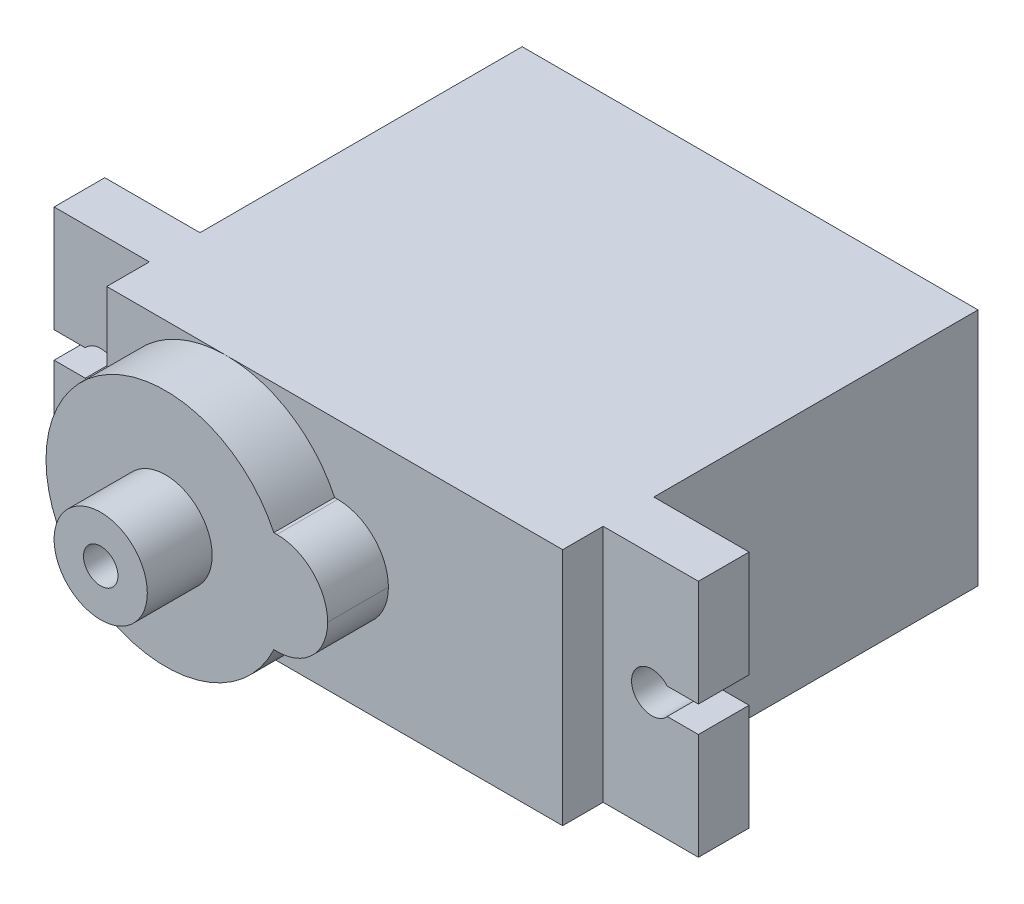
ISO-10303-21;
HEADER;
FILE_DESCRIPTION(('STEP AP214'),'2;1');
FILE_NAME('part.step','',(''),(''),'','','');
FILE_SCHEMA(('AUTOMOTIVE_DESIGN { 1 0 10303 214 1 1 1 1 }'));
ENDSEC;
DATA;
#1=APPLICATION_CONTEXT('core data for automotive mechanical design processes');
#2=APPLICATION_PROTOCOL_DEFINITION('international standard','automotive_design',2000,#1);
#3=PRODUCT_CONTEXT('',#1,'mechanical');
#4=PRODUCT('Part','Part','',(#3));
#5=PRODUCT_RELATED_PRODUCT_CATEGORY('part','',(#4));
#6=PRODUCT_DEFINITION_FORMATION('','',#4);
#7=PRODUCT_DEFINITION_CONTEXT('part definition',#1,'design');
#8=PRODUCT_DEFINITION('design','',#6,#7);
#9=PRODUCT_DEFINITION_SHAPE('','',#8);
#10=(LENGTH_UNIT() NAMED_UNIT(*) SI_UNIT(.MILLI.,.METRE.));
#11=(NAMED_UNIT(*) PLANE_ANGLE_UNIT() SI_UNIT($,.RADIAN.));
#12=(NAMED_UNIT(*) SI_UNIT($,.STERADIAN.) SOLID_ANGLE_UNIT());
#13=UNCERTAINTY_MEASURE_WITH_UNIT(LENGTH_MEASURE(1.E-05),#10,'distance_accuracy_value','');
#14=(GEOMETRIC_REPRESENTATION_CONTEXT(3) GLOBAL_UNCERTAINTY_ASSIGNED_CONTEXT((#13)) GLOBAL_UNIT_ASSIGNED_CONTEXT((#10,
#11,#12)) REPRESENTATION_CONTEXT('',''));
#15=CARTESIAN_POINT('',(0.,0.,0.));
#16=DIRECTION('',(0.,0.,1.));
#17=DIRECTION('',(1.,0.,0.));
#18=AXIS2_PLACEMENT_3D('',#15,#16,#17);
#19=CARTESIAN_POINT('',(19.1009090909091,0.,0.));
#20=DIRECTION('',(-1.,0.,0.));
#21=DIRECTION('',(0.,0.,1.));
#22=AXIS2_PLACEMENT_3D('',#19,#20,#21);
#23=PLANE('',#22);
#24=DIRECTION('',(0.,-1.,0.));
#25=VECTOR('',#24,1.);
#26=CARTESIAN_POINT('',(19.1009090909091,10.3786363636364,18.5));
#27=LINE('',#26,#25);
#28=CARTESIAN_POINT('',(19.1009090909091,10.3786363636364,18.5));
#29=VERTEX_POINT('',#28);
#30=CARTESIAN_POINT('',(19.1009090909091,5.12863636363636,18.5));
#31=VERTEX_POINT('',#30);
#32=EDGE_CURVE('E442',#29,#31,#27,.T.);
#33=ORIENTED_EDGE('',*,*,#32,.T.);
#34=DIRECTION('',(0.,0.,1.));
#35=VECTOR('',#34,1.);
#36=CARTESIAN_POINT('',(19.1009090909091,5.12863636363636,16.));
#37=LINE('',#36,#35);
#38=CARTESIAN_POINT('',(19.1009090909091,5.12863636363636,16.));
#39=VERTEX_POINT('',#38);
#40=EDGE_CURVE('E277',#39,#31,#37,.T.);
#41=ORIENTED_EDGE('',*,*,#40,.F.);
#42=DIRECTION('',(0.,-1.,0.));
#43=VECTOR('',#42,1.);
#44=CARTESIAN_POINT('',(19.1009090909091,10.3786363636364,16.));
#45=LINE('',#44,#43);
#46=CARTESIAN_POINT('',(19.1009090909091,10.3786363636364,16.));
#47=VERTEX_POINT('',#46);
#48=EDGE_CURVE('E434',#47,#39,#45,.T.);
#49=ORIENTED_EDGE('',*,*,#48,.F.);
#50=DIRECTION('',(0.,0.,-1.));
#51=VECTOR('',#50,1.);
#52=CARTESIAN_POINT('',(19.1009090909091,10.3786363636364,18.5));
#53=LINE('',#52,#51);
#54=EDGE_CURVE('E428',#29,#47,#53,.T.);
#55=ORIENTED_EDGE('',*,*,#54,.F.);
#56=EDGE_LOOP('',(#33,#41,#49,#55));
#57=FACE_BOUND('',#56,.T.);
#58=ADVANCED_FACE('F63',(#57),#23,.F.);
#59=CARTESIAN_POINT('',(-12.7990909090909,0.,0.));
#60=DIRECTION('',(-1.,0.,0.));
#61=DIRECTION('',(0.,0.,1.));
#62=AXIS2_PLACEMENT_3D('',#59,#60,#61);
#63=PLANE('',#62);
#64=DIRECTION('',(0.,0.,1.));
#65=VECTOR('',#64,1.);
#66=CARTESIAN_POINT('',(-12.7990909090909,3.82863636363636,0.));
#67=LINE('',#66,#65);
#68=CARTESIAN_POINT('',(-12.7990909090909,3.82863636363636,15.9));
#69=VERTEX_POINT('',#68);
#70=CARTESIAN_POINT('',(-12.7990909090909,3.82863636363636,18.4));
#71=VERTEX_POINT('',#70);
#72=EDGE_CURVE('E12',#69,#71,#67,.T.);
#73=ORIENTED_EDGE('',*,*,#72,.F.);
#74=DIRECTION('',(0.,-1.,0.));
#75=VECTOR('',#74,1.);
#76=CARTESIAN_POINT('',(-12.7990909090909,10.3786363636364,15.9));
#77=LINE('',#76,#75);
#78=CARTESIAN_POINT('',(-12.7990909090909,-1.42136363636364,15.9));
#79=VERTEX_POINT('',#78);
#80=EDGE_CURVE('E400',#69,#79,#77,.T.);
#81=ORIENTED_EDGE('',*,*,#80,.T.);
#82=DIRECTION('',(0.,0.,1.));
#83=VECTOR('',#82,1.);
#84=CARTESIAN_POINT('',(-12.7990909090909,-1.42136363636364,15.9));
#85=LINE('',#84,#83);
#86=CARTESIAN_POINT('',(-12.7990909090909,-1.42136363636364,18.4));
#87=VERTEX_POINT('',#86);
#88=EDGE_CURVE('E387',#79,#87,#85,.T.);
#89=ORIENTED_EDGE('',*,*,#88,.T.);
#90=DIRECTION('',(0.,1.,0.));
#91=VECTOR('',#90,1.);
#92=CARTESIAN_POINT('',(-12.7990909090909,-1.42136363636364,18.4));
#93=LINE('',#92,#91);
#94=EDGE_CURVE('E393',#87,#71,#93,.T.);
#95=ORIENTED_EDGE('',*,*,#94,.T.);
#96=EDGE_LOOP('',(#73,#81,#89,#95));
#97=FACE_BOUND('',#96,.T.);
#98=ADVANCED_FACE('F551',(#97),#63,.T.);
#99=CARTESIAN_POINT('',(-2.19909090909091,4.47863636363636,20.5));
#100=DIRECTION('',(0.,0.,1.));
#101=DIRECTION('',(1.,0.,0.));
#102=AXIS2_PLACEMENT_3D('',#99,#100,#101);
#103=CYLINDRICAL_SURFACE('',#102,5.9);
#104=DIRECTION('',(0.,0.,1.));
#105=VECTOR('',#104,1.);
#106=CARTESIAN_POINT('',(3.14506477726405,1.97863636363636,20.5));
#107=LINE('',#106,#105);
#108=CARTESIAN_POINT('',(3.14506477726405,1.97863636363636,20.5));
#109=VERTEX_POINT('',#108);
#110=CARTESIAN_POINT('',(3.14506477726405,1.97863636363636,23.5));
#111=VERTEX_POINT('',#110);
#112=EDGE_CURVE('E379',#109,#111,#107,.T.);
#113=ORIENTED_EDGE('',*,*,#112,.T.);
#114=CARTESIAN_POINT('',(-2.19909090909091,4.47863636363636,23.5));
#115=DIRECTION('',(0.,0.,1.));
#116=DIRECTION('',(1.,0.,0.));
#117=AXIS2_PLACEMENT_3D('',#114,#115,#116);
#118=CIRCLE('',#117,5.9);
#119=CARTESIAN_POINT('',(3.14506477726405,6.97863636363636,23.5));
#120=VERTEX_POINT('',#119);
#121=EDGE_CURVE('E325',#120,#111,#118,.T.);
#122=ORIENTED_EDGE('',*,*,#121,.F.);
#123=DIRECTION('',(0.,0.,1.));
#124=VECTOR('',#123,1.);
#125=CARTESIAN_POINT('',(3.14506477726405,6.97863636363636,20.5));
#126=LINE('',#125,#124);
#127=CARTESIAN_POINT('',(3.14506477726405,6.97863636363636,20.5));
#128=VERTEX_POINT('',#127);
#129=EDGE_CURVE('E378',#128,#120,#126,.T.);
#130=ORIENTED_EDGE('',*,*,#129,.F.);
#131=CARTESIAN_POINT('',(-2.19909090909091,4.47863636363636,20.5));
#132=DIRECTION('',(0.,0.,1.));
#133=DIRECTION('',(1.,0.,0.));
#134=AXIS2_PLACEMENT_3D('',#131,#132,#133);
#135=CIRCLE('',#134,5.9);
#136=CARTESIAN_POINT('',(-2.19909090909091,10.3786363636364,20.5));
#137=VERTEX_POINT('',#136);
#138=EDGE_CURVE('E355',#128,#137,#135,.T.);
#139=ORIENTED_EDGE('',*,*,#138,.T.);
#140=CARTESIAN_POINT('',(-2.19909090909091,4.47863636363636,20.5));
#141=DIRECTION('',(0.,0.,1.));
#142=DIRECTION('',(1.,0.,0.));
#143=AXIS2_PLACEMENT_3D('',#140,#141,#142);
#144=CIRCLE('',#143,5.9);
#145=CARTESIAN_POINT('',(-8.09909090909091,4.47863636363636,20.5));
#146=VERTEX_POINT('',#145);
#147=EDGE_CURVE('E335',#137,#146,#144,.T.);
#148=ORIENTED_EDGE('',*,*,#147,.T.);
#149=CARTESIAN_POINT('',(-2.19909090909091,4.47863636363636,20.5));
#150=DIRECTION('',(0.,0.,1.));
#151=DIRECTION('',(1.,0.,0.));
#152=AXIS2_PLACEMENT_3D('',#149,#150,#151);
#153=CIRCLE('',#152,5.9);
#154=CARTESIAN_POINT('',(-2.19909090909091,-1.42136363636364,20.5));
#155=VERTEX_POINT('',#154);
#156=EDGE_CURVE('E345',#146,#155,#153,.T.);
#157=ORIENTED_EDGE('',*,*,#156,.T.);
#158=EDGE_CURVE('E360',#155,#109,#135,.T.);
#159=ORIENTED_EDGE('',*,*,#158,.T.);
#160=EDGE_LOOP('',(#113,#122,#130,#139,#148,#157,#159));
#161=FACE_BOUND('',#160,.T.);
#162=ADVANCED_FACE('F558',(#161),#103,.T.);
#163=CARTESIAN_POINT('',(0.,1.97863636363636,20.5));
#164=DIRECTION('',(0.,-1.,0.));
#165=DIRECTION('',(0.,0.,-1.));
#166=AXIS2_PLACEMENT_3D('',#163,#164,#165);
#167=PLANE('',#166);
#168=DIRECTION('',(0.,0.,1.));
#169=VECTOR('',#168,1.);
#170=CARTESIAN_POINT('',(3.30090909090909,1.97863636363636,20.5));
#171=LINE('',#170,#169);
#172=CARTESIAN_POINT('',(3.30090909090909,1.97863636363636,20.5));
#173=VERTEX_POINT('',#172);
#174=CARTESIAN_POINT('',(3.30090909090909,1.97863636363636,23.5));
#175=VERTEX_POINT('',#174);
#176=EDGE_CURVE('E499',#173,#175,#171,.T.);
#177=ORIENTED_EDGE('',*,*,#176,.T.);
#178=DIRECTION('',(1.,0.,0.));
#179=VECTOR('',#178,1.);
#180=CARTESIAN_POINT('',(0.,1.97863636363636,23.5));
#181=LINE('',#180,#179);
#182=EDGE_CURVE('E328',#111,#175,#181,.T.);
#183=ORIENTED_EDGE('',*,*,#182,.F.);
#184=ORIENTED_EDGE('',*,*,#112,.F.);
#185=DIRECTION('',(1.,0.,0.));
#186=VECTOR('',#185,1.);
#187=CARTESIAN_POINT('',(0.,1.97863636363636,20.5));
#188=LINE('',#187,#186);
#189=EDGE_CURVE('E364',#109,#173,#188,.T.);
#190=ORIENTED_EDGE('',*,*,#189,.T.);
#191=EDGE_LOOP('',(#177,#183,#184,#190));
#192=FACE_BOUND('',#191,.T.);
#193=ADVANCED_FACE('F566',(#192),#167,.T.);
#194=CARTESIAN_POINT('',(0.,6.97863636363636,20.5));
#195=DIRECTION('',(0.,-1.,0.));
#196=DIRECTION('',(0.,0.,-1.));
#197=AXIS2_PLACEMENT_3D('',#194,#195,#196);
#198=PLANE('',#197);
#199=DIRECTION('',(1.,0.,0.));
#200=VECTOR('',#199,1.);
#201=CARTESIAN_POINT('',(0.,6.97863636363636,23.5));
#202=LINE('',#201,#200);
#203=CARTESIAN_POINT('',(3.30090909090909,6.97863636363636,23.5));
#204=VERTEX_POINT('',#203);
#205=EDGE_CURVE('E318',#120,#204,#202,.T.);
#206=ORIENTED_EDGE('',*,*,#205,.T.);
#207=DIRECTION('',(0.,0.,1.));
#208=VECTOR('',#207,1.);
#209=CARTESIAN_POINT('',(3.30090909090909,6.97863636363636,20.5));
#210=LINE('',#209,#208);
#211=CARTESIAN_POINT('',(3.30090909090909,6.97863636363636,20.5));
#212=VERTEX_POINT('',#211);
#213=EDGE_CURVE('E509',#204,#212,#210,.F.);
#214=ORIENTED_EDGE('',*,*,#213,.T.);
#215=DIRECTION('',(1.,0.,0.));
#216=VECTOR('',#215,1.);
#217=CARTESIAN_POINT('',(0.,6.97863636363636,20.5));
#218=LINE('',#217,#216);
#219=EDGE_CURVE('E359',#128,#212,#218,.T.);
#220=ORIENTED_EDGE('',*,*,#219,.F.);
#221=ORIENTED_EDGE('',*,*,#129,.T.);
#222=EDGE_LOOP('',(#206,#214,#220,#221));
#223=FACE_BOUND('',#222,.T.);
#224=ADVANCED_FACE('F581',(#223),#198,.F.);
#225=CARTESIAN_POINT('',(3.30090909090909,4.47863636363636,20.5));
#226=DIRECTION('',(0.,0.,1.));
#227=DIRECTION('',(1.,0.,0.));
#228=AXIS2_PLACEMENT_3D('',#225,#226,#227);
#229=CYLINDRICAL_SURFACE('',#228,2.5);
#230=DIRECTION('',(0.,0.,1.));
#231=VECTOR('',#230,1.);
#232=CARTESIAN_POINT('',(5.80090909090909,4.47863636363636,20.5));
#233=LINE('',#232,#231);
#234=CARTESIAN_POINT('',(5.80090909090909,4.47863636363636,23.5));
#235=VERTEX_POINT('',#234);
#236=CARTESIAN_POINT('',(5.80090909090909,4.47863636363636,20.5));
#237=VERTEX_POINT('',#236);
#238=EDGE_CURVE('E503',#235,#237,#233,.F.);
#239=ORIENTED_EDGE('',*,*,#238,.F.);
#240=CARTESIAN_POINT('',(3.30090909090909,4.47863636363636,23.5));
#241=DIRECTION('',(0.,0.,1.));
#242=DIRECTION('',(1.,0.,0.));
#243=AXIS2_PLACEMENT_3D('',#240,#241,#242);
#244=CIRCLE('',#243,2.5);
#245=EDGE_CURVE('E331',#235,#175,#244,.F.);
#246=ORIENTED_EDGE('',*,*,#245,.T.);
#247=ORIENTED_EDGE('',*,*,#176,.F.);
#248=CARTESIAN_POINT('',(3.30090909090909,4.47863636363636,20.5));
#249=DIRECTION('',(0.,0.,1.));
#250=DIRECTION('',(1.,0.,0.));
#251=AXIS2_PLACEMENT_3D('',#248,#249,#250);
#252=CIRCLE('',#251,2.5);
#253=EDGE_CURVE('E506',#237,#173,#252,.F.);
#254=ORIENTED_EDGE('',*,*,#253,.F.);
#255=EDGE_LOOP('',(#239,#246,#247,#254));
#256=FACE_BOUND('',#255,.T.);
#257=ADVANCED_FACE('F574',(#256),#229,.T.);
#258=CARTESIAN_POINT('',(3.30090909090909,4.47863636363636,20.5));
#259=DIRECTION('',(0.,0.,-1.));
#260=DIRECTION('',(-1.,0.,0.));
#261=AXIS2_PLACEMENT_3D('',#258,#259,#260);
#262=CYLINDRICAL_SURFACE('',#261,2.5);
#263=ORIENTED_EDGE('',*,*,#213,.F.);
#264=CARTESIAN_POINT('',(3.30090909090909,4.47863636363636,23.5));
#265=DIRECTION('',(0.,0.,1.));
#266=DIRECTION('',(1.,0.,0.));
#267=AXIS2_PLACEMENT_3D('',#264,#265,#266);
#268=CIRCLE('',#267,2.5);
#269=EDGE_CURVE('E516',#204,#235,#268,.F.);
#270=ORIENTED_EDGE('',*,*,#269,.T.);
#271=ORIENTED_EDGE('',*,*,#238,.T.);
#272=CARTESIAN_POINT('',(3.30090909090909,4.47863636363636,20.5));
#273=DIRECTION('',(0.,0.,1.));
#274=DIRECTION('',(1.,0.,0.));
#275=AXIS2_PLACEMENT_3D('',#272,#273,#274);
#276=CIRCLE('',#275,2.5);
#277=EDGE_CURVE('E512',#212,#237,#276,.F.);
#278=ORIENTED_EDGE('',*,*,#277,.F.);
#279=EDGE_LOOP('',(#263,#270,#271,#278));
#280=FACE_BOUND('',#279,.T.);
#281=ADVANCED_FACE('F65',(#280),#262,.T.);
#282=CARTESIAN_POINT('',(-8.09909090909091,10.3786363636364,26.7));
#283=DIRECTION('',(0.,-1.,0.));
#284=DIRECTION('',(0.,0.,-1.));
#285=AXIS2_PLACEMENT_3D('',#282,#283,#284);
#286=PLANE('',#285);
#287=DIRECTION('',(-1.,0.,0.));
#288=VECTOR('',#287,1.);
#289=CARTESIAN_POINT('',(0.,10.3786363636364,20.5));
#290=LINE('',#289,#288);
#291=CARTESIAN_POINT('',(-8.09909090909091,10.3786363636364,20.5));
#292=VERTEX_POINT('',#291);
#293=EDGE_CURVE('E339',#137,#292,#290,.T.);
#294=ORIENTED_EDGE('',*,*,#293,.F.);
#295=DIRECTION('',(-1.,0.,0.));
#296=VECTOR('',#295,1.);
#297=CARTESIAN_POINT('',(0.,10.3786363636364,20.5));
#298=LINE('',#297,#296);
#299=CARTESIAN_POINT('',(14.4009090909091,10.3786363636364,20.5));
#300=VERTEX_POINT('',#299);
#301=EDGE_CURVE('E374',#300,#137,#298,.T.);
#302=ORIENTED_EDGE('',*,*,#301,.F.);
#303=DIRECTION('',(0.,0.,-1.));
#304=VECTOR('',#303,1.);
#305=CARTESIAN_POINT('',(14.4009090909091,10.3786363636364,26.7));
#306=LINE('',#305,#304);
#307=CARTESIAN_POINT('',(14.4009090909091,10.3786363636364,18.5));
#308=VERTEX_POINT('',#307);
#309=EDGE_CURVE('E488',#300,#308,#306,.T.);
#310=ORIENTED_EDGE('',*,*,#309,.T.);
#311=DIRECTION('',(-1.,0.,0.));
#312=VECTOR('',#311,1.);
#313=CARTESIAN_POINT('',(19.1009090909091,10.3786363636364,18.5));
#314=LINE('',#313,#312);
#315=EDGE_CURVE('E452',#29,#308,#314,.T.);
#316=ORIENTED_EDGE('',*,*,#315,.F.);
#317=ORIENTED_EDGE('',*,*,#54,.T.);
#318=DIRECTION('',(-1.,0.,0.));
#319=VECTOR('',#318,1.);
#320=CARTESIAN_POINT('',(19.1009090909091,10.3786363636364,16.));
#321=LINE('',#320,#319);
#322=CARTESIAN_POINT('',(14.4009090909091,10.3786363636364,16.));
#323=VERTEX_POINT('',#322);
#324=EDGE_CURVE('E446',#47,#323,#321,.T.);
#325=ORIENTED_EDGE('',*,*,#324,.T.);
#326=CARTESIAN_POINT('',(14.4009090909091,10.3786363636364,0.));
#327=VERTEX_POINT('',#326);
#328=EDGE_CURVE('E487',#323,#327,#306,.T.);
#329=ORIENTED_EDGE('',*,*,#328,.T.);
#330=DIRECTION('',(-1.,0.,0.));
#331=VECTOR('',#330,1.);
#332=CARTESIAN_POINT('',(-8.09909090909091,10.3786363636364,0.));
#333=LINE('',#332,#331);
#334=CARTESIAN_POINT('',(-8.09909090909091,10.3786363636364,0.));
#335=VERTEX_POINT('',#334);
#336=EDGE_CURVE('E479',#327,#335,#333,.T.);
#337=ORIENTED_EDGE('',*,*,#336,.T.);
#338=DIRECTION('',(0.,0.,-1.));
#339=VECTOR('',#338,1.);
#340=CARTESIAN_POINT('',(-8.09909090909091,10.3786363636364,26.7));
#341=LINE('',#340,#339);
#342=CARTESIAN_POINT('',(-8.09909090909091,10.3786363636364,15.9));
#343=VERTEX_POINT('',#342);
#344=EDGE_CURVE('E483',#343,#335,#341,.T.);
#345=ORIENTED_EDGE('',*,*,#344,.F.);
#346=DIRECTION('',(1.,0.,0.));
#347=VECTOR('',#346,1.);
#348=CARTESIAN_POINT('',(-12.7990909090909,10.3786363636364,15.9));
#349=LINE('',#348,#347);
#350=CARTESIAN_POINT('',(-12.7990909090909,10.3786363636364,15.9));
#351=VERTEX_POINT('',#350);
#352=EDGE_CURVE('E415',#351,#343,#349,.T.);
#353=ORIENTED_EDGE('',*,*,#352,.F.);
#354=DIRECTION('',(0.,0.,-1.));
#355=VECTOR('',#354,1.);
#356=CARTESIAN_POINT('',(-12.7990909090909,10.3786363636364,18.4));
#357=LINE('',#356,#355);
#358=CARTESIAN_POINT('',(-12.7990909090909,10.3786363636364,18.4));
#359=VERTEX_POINT('',#358);
#360=EDGE_CURVE('E397',#359,#351,#357,.T.);
#361=ORIENTED_EDGE('',*,*,#360,.F.);
#362=DIRECTION('',(1.,0.,0.));
#363=VECTOR('',#362,1.);
#364=CARTESIAN_POINT('',(-12.7990909090909,10.3786363636364,18.4));
#365=LINE('',#364,#363);
#366=CARTESIAN_POINT('',(-8.09909090909091,10.3786363636364,18.4));
#367=VERTEX_POINT('',#366);
#368=EDGE_CURVE('E419',#359,#367,#365,.T.);
#369=ORIENTED_EDGE('',*,*,#368,.T.);
#370=EDGE_CURVE('E484',#292,#367,#341,.T.);
#371=ORIENTED_EDGE('',*,*,#370,.F.);
#372=EDGE_LOOP('',(#294,#302,#310,#316,#317,#325,#329,#337,#345,#353,#361,#369,#371));
#373=FACE_BOUND('',#372,.T.);
#374=ADVANCED_FACE('F540',(#373),#286,.F.);
#375=CARTESIAN_POINT('',(-8.09909090909091,-1.42136363636364,26.7));
#376=DIRECTION('',(1.,0.,0.));
#377=DIRECTION('',(0.,0.,-1.));
#378=AXIS2_PLACEMENT_3D('',#375,#376,#377);
#379=PLANE('',#378);
#380=DIRECTION('',(0.,-1.,0.));
#381=VECTOR('',#380,1.);
#382=CARTESIAN_POINT('',(-8.09909090909091,0.,20.5));
#383=LINE('',#382,#381);
#384=EDGE_CURVE('E342',#292,#146,#383,.T.);
#385=ORIENTED_EDGE('',*,*,#384,.F.);
#386=ORIENTED_EDGE('',*,*,#370,.T.);
#387=DIRECTION('',(0.,1.,0.));
#388=VECTOR('',#387,1.);
#389=CARTESIAN_POINT('',(-8.09909090909091,-1.42136363636364,18.4));
#390=LINE('',#389,#388);
#391=CARTESIAN_POINT('',(-8.09909090909091,-1.42136363636364,18.4));
#392=VERTEX_POINT('',#391);
#393=EDGE_CURVE('E383',#392,#367,#390,.T.);
#394=ORIENTED_EDGE('',*,*,#393,.F.);
#395=DIRECTION('',(0.,0.,-1.));
#396=VECTOR('',#395,1.);
#397=CARTESIAN_POINT('',(-8.09909090909091,-1.42136363636364,26.7));
#398=LINE('',#397,#396);
#399=CARTESIAN_POINT('',(-8.09909090909091,-1.42136363636364,20.5));
#400=VERTEX_POINT('',#399);
#401=EDGE_CURVE('E496',#400,#392,#398,.T.);
#402=ORIENTED_EDGE('',*,*,#401,.F.);
#403=DIRECTION('',(0.,-1.,0.));
#404=VECTOR('',#403,1.);
#405=CARTESIAN_POINT('',(-8.09909090909091,0.,20.5));
#406=LINE('',#405,#404);
#407=EDGE_CURVE('E349',#146,#400,#406,.T.);
#408=ORIENTED_EDGE('',*,*,#407,.F.);
#409=EDGE_LOOP('',(#385,#386,#394,#402,#408));
#410=FACE_BOUND('',#409,.T.);
#411=ADVANCED_FACE('F590',(#410),#379,.F.);
#412=CARTESIAN_POINT('',(-8.09909090909091,-1.42136363636364,26.7));
#413=DIRECTION('',(0.,1.,0.));
#414=DIRECTION('',(-1.,0.,0.));
#415=AXIS2_PLACEMENT_3D('',#412,#413,#414);
#416=PLANE('',#415);
#417=DIRECTION('',(1.,0.,0.));
#418=VECTOR('',#417,1.);
#419=CARTESIAN_POINT('',(0.,-1.42136363636364,20.5));
#420=LINE('',#419,#418);
#421=EDGE_CURVE('E352',#400,#155,#420,.T.);
#422=ORIENTED_EDGE('',*,*,#421,.F.);
#423=ORIENTED_EDGE('',*,*,#401,.T.);
#424=DIRECTION('',(1.,0.,0.));
#425=VECTOR('',#424,1.);
#426=CARTESIAN_POINT('',(-12.7990909090909,-1.42136363636364,18.4));
#427=LINE('',#426,#425);
#428=EDGE_CURVE('E423',#87,#392,#427,.T.);
#429=ORIENTED_EDGE('',*,*,#428,.F.);
#430=ORIENTED_EDGE('',*,*,#88,.F.);
#431=DIRECTION('',(1.,0.,0.));
#432=VECTOR('',#431,1.);
#433=CARTESIAN_POINT('',(-12.7990909090909,-1.42136363636364,15.9));
#434=LINE('',#433,#432);
#435=CARTESIAN_POINT('',(-8.09909090909091,-1.42136363636364,15.9));
#436=VERTEX_POINT('',#435);
#437=EDGE_CURVE('E405',#79,#436,#434,.T.);
#438=ORIENTED_EDGE('',*,*,#437,.T.);
#439=CARTESIAN_POINT('',(-8.09909090909091,-1.42136363636364,0.));
#440=VERTEX_POINT('',#439);
#441=EDGE_CURVE('E495',#436,#440,#398,.T.);
#442=ORIENTED_EDGE('',*,*,#441,.T.);
#443=DIRECTION('',(1.,0.,0.));
#444=VECTOR('',#443,1.);
#445=CARTESIAN_POINT('',(-8.09909090909091,-1.42136363636364,0.));
#446=LINE('',#445,#444);
#447=CARTESIAN_POINT('',(14.4009090909091,-1.42136363636364,0.));
#448=VERTEX_POINT('',#447);
#449=EDGE_CURVE('E471',#440,#448,#446,.T.);
#450=ORIENTED_EDGE('',*,*,#449,.T.);
#451=DIRECTION('',(0.,0.,-1.));
#452=VECTOR('',#451,1.);
#453=CARTESIAN_POINT('',(14.4009090909091,-1.42136363636364,26.7));
#454=LINE('',#453,#452);
#455=CARTESIAN_POINT('',(14.4009090909091,-1.42136363636364,16.));
#456=VERTEX_POINT('',#455);
#457=EDGE_CURVE('E491',#456,#448,#454,.T.);
#458=ORIENTED_EDGE('',*,*,#457,.F.);
#459=DIRECTION('',(-1.,0.,0.));
#460=VECTOR('',#459,1.);
#461=CARTESIAN_POINT('',(19.1009090909091,-1.42136363636364,16.));
#462=LINE('',#461,#460);
#463=CARTESIAN_POINT('',(19.1009090909091,-1.42136363636364,16.));
#464=VERTEX_POINT('',#463);
#465=EDGE_CURVE('E461',#464,#456,#462,.T.);
#466=ORIENTED_EDGE('',*,*,#465,.F.);
#467=DIRECTION('',(0.,0.,1.));
#468=VECTOR('',#467,1.);
#469=CARTESIAN_POINT('',(19.1009090909091,-1.42136363636364,16.));
#470=LINE('',#469,#468);
#471=CARTESIAN_POINT('',(19.1009090909091,-1.42136363636364,18.5));
#472=VERTEX_POINT('',#471);
#473=EDGE_CURVE('E437',#464,#472,#470,.T.);
#474=ORIENTED_EDGE('',*,*,#473,.T.);
#475=DIRECTION('',(-1.,0.,0.));
#476=VECTOR('',#475,1.);
#477=CARTESIAN_POINT('',(19.1009090909091,-1.42136363636364,18.5));
#478=LINE('',#477,#476);
#479=CARTESIAN_POINT('',(14.4009090909091,-1.42136363636364,18.5));
#480=VERTEX_POINT('',#479);
#481=EDGE_CURVE('E457',#472,#480,#478,.T.);
#482=ORIENTED_EDGE('',*,*,#481,.T.);
#483=CARTESIAN_POINT('',(14.4009090909091,-1.42136363636364,20.5));
#484=VERTEX_POINT('',#483);
#485=EDGE_CURVE('E492',#484,#480,#454,.T.);
#486=ORIENTED_EDGE('',*,*,#485,.F.);
#487=DIRECTION('',(1.,0.,0.));
#488=VECTOR('',#487,1.);
#489=CARTESIAN_POINT('',(0.,-1.42136363636364,20.5));
#490=LINE('',#489,#488);
#491=EDGE_CURVE('E368',#155,#484,#490,.T.);
#492=ORIENTED_EDGE('',*,*,#491,.F.);
#493=EDGE_LOOP('',(#422,#423,#429,#430,#438,#442,#450,#458,#466,#474,#482,#486,#492));
#494=FACE_BOUND('',#493,.T.);
#495=ADVANCED_FACE('F546',(#494),#416,.F.);
#496=CARTESIAN_POINT('',(14.4009090909091,-1.42136363636364,26.7));
#497=DIRECTION('',(-1.,0.,0.));
#498=DIRECTION('',(0.,0.,1.));
#499=AXIS2_PLACEMENT_3D('',#496,#497,#498);
#500=PLANE('',#499);
#501=DIRECTION('',(0.,1.,0.));
#502=VECTOR('',#501,1.);
#503=CARTESIAN_POINT('',(14.4009090909091,0.,20.5));
#504=LINE('',#503,#502);
#505=EDGE_CURVE('E371',#484,#300,#504,.T.);
#506=ORIENTED_EDGE('',*,*,#505,.F.);
#507=ORIENTED_EDGE('',*,*,#485,.T.);
#508=DIRECTION('',(0.,-1.,0.));
#509=VECTOR('',#508,1.);
#510=CARTESIAN_POINT('',(14.4009090909091,10.3786363636364,18.5));
#511=LINE('',#510,#509);
#512=EDGE_CURVE('E433',#308,#480,#511,.T.);
#513=ORIENTED_EDGE('',*,*,#512,.F.);
#514=ORIENTED_EDGE('',*,*,#309,.F.);
#515=EDGE_LOOP('',(#506,#507,#513,#514));
#516=FACE_BOUND('',#515,.T.);
#517=ADVANCED_FACE('F597',(#516),#500,.F.);
#518=DIRECTION('',(0.,-1.,0.));
#519=VECTOR('',#518,1.);
#520=CARTESIAN_POINT('',(-8.09909090909091,10.3786363636364,15.9));
#521=LINE('',#520,#519);
#522=EDGE_CURVE('E392',#343,#436,#521,.T.);
#523=ORIENTED_EDGE('',*,*,#522,.F.);
#524=ORIENTED_EDGE('',*,*,#344,.T.);
#525=DIRECTION('',(0.,-1.,0.));
#526=VECTOR('',#525,1.);
#527=CARTESIAN_POINT('',(-8.09909090909091,-1.42136363636364,0.));
#528=LINE('',#527,#526);
#529=EDGE_CURVE('E456',#335,#440,#528,.T.);
#530=ORIENTED_EDGE('',*,*,#529,.T.);
#531=ORIENTED_EDGE('',*,*,#441,.F.);
#532=EDGE_LOOP('',(#523,#524,#530,#531));
#533=FACE_BOUND('',#532,.T.);
#534=ADVANCED_FACE('F865',(#533),#379,.F.);
#535=ORIENTED_EDGE('',*,*,#328,.F.);
#536=DIRECTION('',(0.,-1.,0.));
#537=VECTOR('',#536,1.);
#538=CARTESIAN_POINT('',(14.4009090909091,10.3786363636364,16.));
#539=LINE('',#538,#537);
#540=EDGE_CURVE('E427',#323,#456,#539,.T.);
#541=ORIENTED_EDGE('',*,*,#540,.T.);
#542=ORIENTED_EDGE('',*,*,#457,.T.);
#543=DIRECTION('',(0.,1.,0.));
#544=VECTOR('',#543,1.);
#545=CARTESIAN_POINT('',(14.4009090909091,-1.42136363636364,0.));
#546=LINE('',#545,#544);
#547=EDGE_CURVE('E475',#448,#327,#546,.T.);
#548=ORIENTED_EDGE('',*,*,#547,.T.);
#549=EDGE_LOOP('',(#535,#541,#542,#548));
#550=FACE_BOUND('',#549,.T.);
#551=ADVANCED_FACE('F647',(#550),#500,.F.);
#552=CARTESIAN_POINT('',(0.,0.,0.));
#553=DIRECTION('',(0.,0.,-1.));
#554=DIRECTION('',(-1.,0.,0.));
#555=AXIS2_PLACEMENT_3D('',#552,#553,#554);
#556=PLANE('',#555);
#557=ORIENTED_EDGE('',*,*,#529,.F.);
#558=ORIENTED_EDGE('',*,*,#336,.F.);
#559=ORIENTED_EDGE('',*,*,#547,.F.);
#560=ORIENTED_EDGE('',*,*,#449,.F.);
#561=EDGE_LOOP('',(#557,#558,#559,#560));
#562=FACE_BOUND('',#561,.T.);
#563=ADVANCED_FACE('F653',(#562),#556,.T.);
#564=CARTESIAN_POINT('',(19.1009090909091,10.3786363636364,18.5));
#565=DIRECTION('',(0.,0.,-1.));
#566=DIRECTION('',(0.,1.,0.));
#567=AXIS2_PLACEMENT_3D('',#564,#565,#566);
#568=PLANE('',#567);
#569=CARTESIAN_POINT('',(16.8009090909091,4.47863636363637,18.5));
#570=DIRECTION('',(0.,0.,1.));
#571=DIRECTION('',(1.,0.,0.));
#572=AXIS2_PLACEMENT_3D('',#569,#570,#571);
#573=CIRCLE('',#572,1.);
#574=CARTESIAN_POINT('',(17.5608432985876,5.12863636363636,18.5));
#575=VERTEX_POINT('',#574);
#576=CARTESIAN_POINT('',(17.5608432985876,3.82863636363636,18.5));
#577=VERTEX_POINT('',#576);
#578=EDGE_CURVE('E246',#575,#577,#573,.T.);
#579=ORIENTED_EDGE('',*,*,#578,.F.);
#580=DIRECTION('',(-1.,0.,0.));
#581=VECTOR('',#580,1.);
#582=CARTESIAN_POINT('',(17.5608432985876,5.12863636363636,18.5));
#583=LINE('',#582,#581);
#584=EDGE_CURVE('E261',#31,#575,#583,.T.);
#585=ORIENTED_EDGE('',*,*,#584,.F.);
#586=ORIENTED_EDGE('',*,*,#32,.F.);
#587=ORIENTED_EDGE('',*,*,#315,.T.);
#588=ORIENTED_EDGE('',*,*,#512,.T.);
#589=ORIENTED_EDGE('',*,*,#481,.F.);
#590=CARTESIAN_POINT('',(19.1009090909091,3.82863636363636,18.5));
#591=VERTEX_POINT('',#590);
#592=EDGE_CURVE('E441',#591,#472,#27,.T.);
#593=ORIENTED_EDGE('',*,*,#592,.F.);
#594=DIRECTION('',(1.,0.,0.));
#595=VECTOR('',#594,1.);
#596=CARTESIAN_POINT('',(17.5608432985876,3.82863636363636,18.5));
#597=LINE('',#596,#595);
#598=EDGE_CURVE('E79',#577,#591,#597,.T.);
#599=ORIENTED_EDGE('',*,*,#598,.F.);
#600=EDGE_LOOP('',(#579,#585,#586,#587,#588,#589,#593,#599));
#601=FACE_BOUND('',#600,.T.);
#602=ADVANCED_FACE('F634',(#601),#568,.F.);
#603=CARTESIAN_POINT('',(19.1009090909091,10.3786363636364,16.));
#604=DIRECTION('',(0.,0.,-1.));
#605=DIRECTION('',(-1.,0.,0.));
#606=AXIS2_PLACEMENT_3D('',#603,#604,#605);
#607=PLANE('',#606);
#608=DIRECTION('',(-1.,0.,0.));
#609=VECTOR('',#608,1.);
#610=CARTESIAN_POINT('',(17.5608432985876,5.12863636363636,16.));
#611=LINE('',#610,#609);
#612=CARTESIAN_POINT('',(17.5608432985876,5.12863636363636,16.));
#613=VERTEX_POINT('',#612);
#614=EDGE_CURVE('E249',#39,#613,#611,.T.);
#615=ORIENTED_EDGE('',*,*,#614,.T.);
#616=CARTESIAN_POINT('',(16.8009090909091,4.47863636363637,16.));
#617=DIRECTION('',(0.,0.,1.));
#618=DIRECTION('',(1.,0.,0.));
#619=AXIS2_PLACEMENT_3D('',#616,#617,#618);
#620=CIRCLE('',#619,1.);
#621=CARTESIAN_POINT('',(17.5608432985876,3.82863636363636,16.));
#622=VERTEX_POINT('',#621);
#623=EDGE_CURVE('E243',#613,#622,#620,.T.);
#624=ORIENTED_EDGE('',*,*,#623,.T.);
#625=DIRECTION('',(1.,0.,0.));
#626=VECTOR('',#625,1.);
#627=CARTESIAN_POINT('',(17.5608432985876,3.82863636363636,16.));
#628=LINE('',#627,#626);
#629=CARTESIAN_POINT('',(19.1009090909091,3.82863636363636,16.));
#630=VERTEX_POINT('',#629);
#631=EDGE_CURVE('E252',#622,#630,#628,.T.);
#632=ORIENTED_EDGE('',*,*,#631,.T.);
#633=EDGE_CURVE('E432',#630,#464,#45,.T.);
#634=ORIENTED_EDGE('',*,*,#633,.T.);
#635=ORIENTED_EDGE('',*,*,#465,.T.);
#636=ORIENTED_EDGE('',*,*,#540,.F.);
#637=ORIENTED_EDGE('',*,*,#324,.F.);
#638=ORIENTED_EDGE('',*,*,#48,.T.);
#639=EDGE_LOOP('',(#615,#624,#632,#634,#635,#636,#637,#638));
#640=FACE_BOUND('',#639,.T.);
#641=ADVANCED_FACE('F258',(#640),#607,.T.);
#642=ORIENTED_EDGE('',*,*,#633,.F.);
#643=DIRECTION('',(0.,0.,1.));
#644=VECTOR('',#643,1.);
#645=CARTESIAN_POINT('',(19.1009090909091,3.82863636363636,16.));
#646=LINE('',#645,#644);
#647=EDGE_CURVE('E248',#630,#591,#646,.T.);
#648=ORIENTED_EDGE('',*,*,#647,.T.);
#649=ORIENTED_EDGE('',*,*,#592,.T.);
#650=ORIENTED_EDGE('',*,*,#473,.F.);
#651=EDGE_LOOP('',(#642,#648,#649,#650));
#652=FACE_BOUND('',#651,.T.);
#653=ADVANCED_FACE('F616',(#652),#23,.F.);
#654=CARTESIAN_POINT('',(-12.7990909090909,-1.42136363636364,18.4));
#655=DIRECTION('',(0.,0.,-1.));
#656=DIRECTION('',(-1.,0.,0.));
#657=AXIS2_PLACEMENT_3D('',#654,#655,#656);
#658=PLANE('',#657);
#659=CARTESIAN_POINT('',(-10.4990909090909,4.47863636363636,18.4));
#660=DIRECTION('',(0.,0.,1.));
#661=DIRECTION('',(1.,0.,0.));
#662=AXIS2_PLACEMENT_3D('',#659,#660,#661);
#663=CIRCLE('',#662,1.);
#664=CARTESIAN_POINT('',(-11.2590251167694,3.82863636363636,18.4));
#665=VERTEX_POINT('',#664);
#666=CARTESIAN_POINT('',(-11.2590251167694,5.12863636363636,18.4));
#667=VERTEX_POINT('',#666);
#668=EDGE_CURVE('E276',#665,#667,#663,.T.);
#669=ORIENTED_EDGE('',*,*,#668,.F.);
#670=DIRECTION('',(1.,0.,0.));
#671=VECTOR('',#670,1.);
#672=CARTESIAN_POINT('',(-12.8657589512663,3.82863636363636,18.4));
#673=LINE('',#672,#671);
#674=EDGE_CURVE('E287',#71,#665,#673,.T.);
#675=ORIENTED_EDGE('',*,*,#674,.F.);
#676=ORIENTED_EDGE('',*,*,#94,.F.);
#677=ORIENTED_EDGE('',*,*,#428,.T.);
#678=ORIENTED_EDGE('',*,*,#393,.T.);
#679=ORIENTED_EDGE('',*,*,#368,.F.);
#680=CARTESIAN_POINT('',(-12.7990909090909,5.12863636363636,18.4));
#681=VERTEX_POINT('',#680);
#682=EDGE_CURVE('E391',#681,#359,#93,.T.);
#683=ORIENTED_EDGE('',*,*,#682,.F.);
#684=DIRECTION('',(-1.,0.,0.));
#685=VECTOR('',#684,1.);
#686=CARTESIAN_POINT('',(-12.8657589512663,5.12863636363636,18.4));
#687=LINE('',#686,#685);
#688=EDGE_CURVE('E87',#667,#681,#687,.T.);
#689=ORIENTED_EDGE('',*,*,#688,.F.);
#690=EDGE_LOOP('',(#669,#675,#676,#677,#678,#679,#683,#689));
#691=FACE_BOUND('',#690,.T.);
#692=ADVANCED_FACE('F626',(#691),#658,.F.);
#693=CARTESIAN_POINT('',(-12.7990909090909,10.3786363636364,15.9));
#694=DIRECTION('',(0.,0.,1.));
#695=DIRECTION('',(1.,0.,0.));
#696=AXIS2_PLACEMENT_3D('',#693,#694,#695);
#697=PLANE('',#696);
#698=ORIENTED_EDGE('',*,*,#80,.F.);
#699=DIRECTION('',(1.,0.,0.));
#700=VECTOR('',#699,1.);
#701=CARTESIAN_POINT('',(-12.8657589512663,3.82863636363636,15.9));
#702=LINE('',#701,#700);
#703=CARTESIAN_POINT('',(-11.2590251167694,3.82863636363636,15.9));
#704=VERTEX_POINT('',#703);
#705=EDGE_CURVE('E291',#69,#704,#702,.T.);
#706=ORIENTED_EDGE('',*,*,#705,.T.);
#707=CARTESIAN_POINT('',(-10.4990909090909,4.47863636363636,15.9));
#708=DIRECTION('',(0.,0.,1.));
#709=DIRECTION('',(1.,0.,0.));
#710=AXIS2_PLACEMENT_3D('',#707,#708,#709);
#711=CIRCLE('',#710,1.);
#712=CARTESIAN_POINT('',(-11.2590251167694,5.12863636363636,15.9));
#713=VERTEX_POINT('',#712);
#714=EDGE_CURVE('E282',#704,#713,#711,.T.);
#715=ORIENTED_EDGE('',*,*,#714,.T.);
#716=DIRECTION('',(-1.,0.,0.));
#717=VECTOR('',#716,1.);
#718=CARTESIAN_POINT('',(-12.8657589512663,5.12863636363636,15.9));
#719=LINE('',#718,#717);
#720=CARTESIAN_POINT('',(-12.7990909090909,5.12863636363636,15.9));
#721=VERTEX_POINT('',#720);
#722=EDGE_CURVE('E286',#713,#721,#719,.T.);
#723=ORIENTED_EDGE('',*,*,#722,.T.);
#724=EDGE_CURVE('E401',#351,#721,#77,.T.);
#725=ORIENTED_EDGE('',*,*,#724,.F.);
#726=ORIENTED_EDGE('',*,*,#352,.T.);
#727=ORIENTED_EDGE('',*,*,#522,.T.);
#728=ORIENTED_EDGE('',*,*,#437,.F.);
#729=EDGE_LOOP('',(#698,#706,#715,#723,#725,#726,#727,#728));
#730=FACE_BOUND('',#729,.T.);
#731=ADVANCED_FACE('F531',(#730),#697,.F.);
#732=DIRECTION('',(0.,0.,-1.));
#733=VECTOR('',#732,1.);
#734=CARTESIAN_POINT('',(-12.7990909090909,5.12863636363636,0.));
#735=LINE('',#734,#733);
#736=EDGE_CURVE('E72',#681,#721,#735,.T.);
#737=ORIENTED_EDGE('',*,*,#736,.F.);
#738=ORIENTED_EDGE('',*,*,#682,.T.);
#739=ORIENTED_EDGE('',*,*,#360,.T.);
#740=ORIENTED_EDGE('',*,*,#724,.T.);
#741=EDGE_LOOP('',(#737,#738,#739,#740));
#742=FACE_BOUND('',#741,.T.);
#743=ADVANCED_FACE('F533',(#742),#63,.T.);
#744=CARTESIAN_POINT('',(0.,0.,20.5));
#745=DIRECTION('',(0.,0.,1.));
#746=DIRECTION('',(1.,0.,0.));
#747=AXIS2_PLACEMENT_3D('',#744,#745,#746);
#748=PLANE('',#747);
#749=ORIENTED_EDGE('',*,*,#138,.F.);
#750=ORIENTED_EDGE('',*,*,#219,.T.);
#751=ORIENTED_EDGE('',*,*,#277,.T.);
#752=ORIENTED_EDGE('',*,*,#253,.T.);
#753=ORIENTED_EDGE('',*,*,#189,.F.);
#754=ORIENTED_EDGE('',*,*,#158,.F.);
#755=ORIENTED_EDGE('',*,*,#491,.T.);
#756=ORIENTED_EDGE('',*,*,#505,.T.);
#757=ORIENTED_EDGE('',*,*,#301,.T.);
#758=EDGE_LOOP('',(#749,#750,#751,#752,#753,#754,#755,#756,#757));
#759=FACE_BOUND('',#758,.T.);
#760=ADVANCED_FACE('F569',(#759),#748,.T.);
#761=CARTESIAN_POINT('',(0.,0.,20.5));
#762=DIRECTION('',(0.,0.,1.));
#763=DIRECTION('',(1.,0.,0.));
#764=AXIS2_PLACEMENT_3D('',#761,#762,#763);
#765=PLANE('',#764);
#766=ORIENTED_EDGE('',*,*,#156,.F.);
#767=ORIENTED_EDGE('',*,*,#407,.T.);
#768=ORIENTED_EDGE('',*,*,#421,.T.);
#769=EDGE_LOOP('',(#766,#767,#768));
#770=FACE_BOUND('',#769,.T.);
#771=ADVANCED_FACE('F586',(#770),#765,.T.);
#772=CARTESIAN_POINT('',(0.,0.,20.5));
#773=DIRECTION('',(0.,0.,1.));
#774=DIRECTION('',(1.,0.,0.));
#775=AXIS2_PLACEMENT_3D('',#772,#773,#774);
#776=PLANE('',#775);
#777=ORIENTED_EDGE('',*,*,#147,.F.);
#778=ORIENTED_EDGE('',*,*,#293,.T.);
#779=ORIENTED_EDGE('',*,*,#384,.T.);
#780=EDGE_LOOP('',(#777,#778,#779));
#781=FACE_BOUND('',#780,.T.);
#782=ADVANCED_FACE('F600',(#781),#776,.T.);
#783=CARTESIAN_POINT('',(0.,0.,23.5));
#784=DIRECTION('',(0.,0.,1.));
#785=DIRECTION('',(1.,0.,0.));
#786=AXIS2_PLACEMENT_3D('',#783,#784,#785);
#787=PLANE('',#786);
#788=CARTESIAN_POINT('',(-2.19909090909091,4.47863636363637,23.5));
#789=DIRECTION('',(0.,0.,1.));
#790=DIRECTION('',(1.,0.,0.));
#791=AXIS2_PLACEMENT_3D('',#788,#789,#790);
#792=CIRCLE('',#791,2.3);
#793=CARTESIAN_POINT('',(0.100909090909091,4.47863636363637,23.5));
#794=VERTEX_POINT('',#793);
#795=EDGE_CURVE('E313',#794,#794,#792,.T.);
#796=ORIENTED_EDGE('',*,*,#795,.F.);
#797=EDGE_LOOP('',(#796));
#798=FACE_BOUND('',#797,.T.);
#799=ORIENTED_EDGE('',*,*,#269,.F.);
#800=ORIENTED_EDGE('',*,*,#205,.F.);
#801=ORIENTED_EDGE('',*,*,#121,.T.);
#802=ORIENTED_EDGE('',*,*,#182,.T.);
#803=ORIENTED_EDGE('',*,*,#245,.F.);
#804=EDGE_LOOP('',(#799,#800,#801,#802,#803));
#805=FACE_BOUND('',#804,.T.);
#806=ADVANCED_FACE('F576',(#798,#805),#787,.T.);
#807=CARTESIAN_POINT('',(-2.19909090909091,4.47863636363637,26.7));
#808=DIRECTION('',(0.,0.,1.));
#809=DIRECTION('',(1.,0.,0.));
#810=AXIS2_PLACEMENT_3D('',#807,#808,#809);
#811=PLANE('',#810);
#812=CARTESIAN_POINT('',(-2.19909090909091,4.47863636363637,26.7));
#813=DIRECTION('',(0.,0.,1.));
#814=DIRECTION('',(1.,0.,0.));
#815=AXIS2_PLACEMENT_3D('',#812,#813,#814);
#816=CIRCLE('',#815,2.3);
#817=CARTESIAN_POINT('',(0.100909090909091,4.47863636363637,26.7));
#818=VERTEX_POINT('',#817);
#819=EDGE_CURVE('E314',#818,#818,#816,.T.);
#820=ORIENTED_EDGE('',*,*,#819,.T.);
#821=EDGE_LOOP('',(#820));
#822=FACE_BOUND('',#821,.T.);
#823=CARTESIAN_POINT('',(-2.19909090909091,4.47863636363637,26.7));
#824=DIRECTION('',(0.,0.,1.));
#825=DIRECTION('',(1.,0.,0.));
#826=AXIS2_PLACEMENT_3D('',#823,#824,#825);
#827=CIRCLE('',#826,0.85);
#828=CARTESIAN_POINT('',(-1.34909090909091,4.47863636363637,26.7));
#829=VERTEX_POINT('',#828);
#830=EDGE_CURVE('E307',#829,#829,#827,.T.);
#831=ORIENTED_EDGE('',*,*,#830,.F.);
#832=EDGE_LOOP('',(#831));
#833=FACE_BOUND('',#832,.T.);
#834=ADVANCED_FACE('F608',(#822,#833),#811,.T.);
#835=CARTESIAN_POINT('',(-2.19909090909091,4.47863636363637,26.7));
#836=DIRECTION('',(0.,0.,-1.));
#837=DIRECTION('',(-1.,0.,0.));
#838=AXIS2_PLACEMENT_3D('',#835,#836,#837);
#839=CYLINDRICAL_SURFACE('',#838,2.3);
#840=ORIENTED_EDGE('',*,*,#819,.F.);
#841=EDGE_LOOP('',(#840));
#842=FACE_BOUND('',#841,.T.);
#843=ORIENTED_EDGE('',*,*,#795,.T.);
#844=EDGE_LOOP('',(#843));
#845=FACE_BOUND('',#844,.T.);
#846=ADVANCED_FACE('F682',(#842,#845),#839,.T.);
#847=CARTESIAN_POINT('',(-2.19909090909091,4.47863636363637,26.7));
#848=DIRECTION('',(0.,0.,-1.));
#849=DIRECTION('',(-1.,0.,0.));
#850=AXIS2_PLACEMENT_3D('',#847,#848,#849);
#851=CYLINDRICAL_SURFACE('',#850,0.85);
#852=ORIENTED_EDGE('',*,*,#830,.T.);
#853=EDGE_LOOP('',(#852));
#854=FACE_BOUND('',#853,.T.);
#855=CARTESIAN_POINT('',(-2.19909090909091,4.47863636363637,23.5));
#856=DIRECTION('',(0.,0.,1.));
#857=DIRECTION('',(1.,0.,0.));
#858=AXIS2_PLACEMENT_3D('',#855,#856,#857);
#859=CIRCLE('',#858,0.85);
#860=CARTESIAN_POINT('',(-1.34909090909091,4.47863636363637,23.5));
#861=VERTEX_POINT('',#860);
#862=EDGE_CURVE('E520',#861,#861,#859,.F.);
#863=ORIENTED_EDGE('',*,*,#862,.T.);
#864=EDGE_LOOP('',(#863));
#865=FACE_BOUND('',#864,.T.);
#866=ADVANCED_FACE('F679',(#854,#865),#851,.F.);
#867=ORIENTED_EDGE('',*,*,#862,.F.);
#868=EDGE_LOOP('',(#867));
#869=FACE_BOUND('',#868,.T.);
#870=ADVANCED_FACE('F611',(#869),#787,.T.);
#871=CARTESIAN_POINT('',(-10.4990909090909,4.47863636363636,15.9));
#872=DIRECTION('',(0.,0.,1.));
#873=DIRECTION('',(1.,0.,0.));
#874=AXIS2_PLACEMENT_3D('',#871,#872,#873);
#875=CYLINDRICAL_SURFACE('',#874,1.);
#876=ORIENTED_EDGE('',*,*,#668,.T.);
#877=DIRECTION('',(0.,0.,1.));
#878=VECTOR('',#877,1.);
#879=CARTESIAN_POINT('',(-11.2590251167694,5.12863636363636,15.9));
#880=LINE('',#879,#878);
#881=EDGE_CURVE('E295',#713,#667,#880,.T.);
#882=ORIENTED_EDGE('',*,*,#881,.F.);
#883=ORIENTED_EDGE('',*,*,#714,.F.);
#884=DIRECTION('',(0.,0.,1.));
#885=VECTOR('',#884,1.);
#886=CARTESIAN_POINT('',(-11.2590251167694,3.82863636363636,15.9));
#887=LINE('',#886,#885);
#888=EDGE_CURVE('E303',#704,#665,#887,.T.);
#889=ORIENTED_EDGE('',*,*,#888,.T.);
#890=EDGE_LOOP('',(#876,#882,#883,#889));
#891=FACE_BOUND('',#890,.T.);
#892=ADVANCED_FACE('F673',(#891),#875,.F.);
#893=CARTESIAN_POINT('',(-12.8657589512663,3.82863636363636,15.9));
#894=DIRECTION('',(0.,-1.,0.));
#895=DIRECTION('',(0.,0.,-1.));
#896=AXIS2_PLACEMENT_3D('',#893,#894,#895);
#897=PLANE('',#896);
#898=ORIENTED_EDGE('',*,*,#72,.T.);
#899=ORIENTED_EDGE('',*,*,#674,.T.);
#900=ORIENTED_EDGE('',*,*,#888,.F.);
#901=ORIENTED_EDGE('',*,*,#705,.F.);
#902=EDGE_LOOP('',(#898,#899,#900,#901));
#903=FACE_BOUND('',#902,.T.);
#904=ADVANCED_FACE('F670',(#903),#897,.F.);
#905=CARTESIAN_POINT('',(-12.8657589512663,5.12863636363636,15.9));
#906=DIRECTION('',(0.,1.,0.));
#907=DIRECTION('',(0.,0.,1.));
#908=AXIS2_PLACEMENT_3D('',#905,#906,#907);
#909=PLANE('',#908);
#910=ORIENTED_EDGE('',*,*,#736,.T.);
#911=ORIENTED_EDGE('',*,*,#722,.F.);
#912=ORIENTED_EDGE('',*,*,#881,.T.);
#913=ORIENTED_EDGE('',*,*,#688,.T.);
#914=EDGE_LOOP('',(#910,#911,#912,#913));
#915=FACE_BOUND('',#914,.T.);
#916=ADVANCED_FACE('F525',(#915),#909,.F.);
#917=CARTESIAN_POINT('',(16.8009090909091,4.47863636363637,16.));
#918=DIRECTION('',(0.,0.,1.));
#919=DIRECTION('',(1.,0.,0.));
#920=AXIS2_PLACEMENT_3D('',#917,#918,#919);
#921=CYLINDRICAL_SURFACE('',#920,1.);
#922=ORIENTED_EDGE('',*,*,#578,.T.);
#923=DIRECTION('',(0.,0.,1.));
#924=VECTOR('',#923,1.);
#925=CARTESIAN_POINT('',(17.5608432985876,3.82863636363636,16.));
#926=LINE('',#925,#924);
#927=EDGE_CURVE('E239',#622,#577,#926,.T.);
#928=ORIENTED_EDGE('',*,*,#927,.F.);
#929=ORIENTED_EDGE('',*,*,#623,.F.);
#930=DIRECTION('',(0.,0.,1.));
#931=VECTOR('',#930,1.);
#932=CARTESIAN_POINT('',(17.5608432985876,5.12863636363636,16.));
#933=LINE('',#932,#931);
#934=EDGE_CURVE('E273',#613,#575,#933,.T.);
#935=ORIENTED_EDGE('',*,*,#934,.T.);
#936=EDGE_LOOP('',(#922,#928,#929,#935));
#937=FACE_BOUND('',#936,.T.);
#938=ADVANCED_FACE('F241',(#937),#921,.F.);
#939=CARTESIAN_POINT('',(17.5608432985876,5.12863636363636,16.));
#940=DIRECTION('',(0.,1.,0.));
#941=DIRECTION('',(0.,0.,1.));
#942=AXIS2_PLACEMENT_3D('',#939,#940,#941);
#943=PLANE('',#942);
#944=ORIENTED_EDGE('',*,*,#584,.T.);
#945=ORIENTED_EDGE('',*,*,#934,.F.);
#946=ORIENTED_EDGE('',*,*,#614,.F.);
#947=ORIENTED_EDGE('',*,*,#40,.T.);
#948=EDGE_LOOP('',(#944,#945,#946,#947));
#949=FACE_BOUND('',#948,.T.);
#950=ADVANCED_FACE('F661',(#949),#943,.F.);
#951=CARTESIAN_POINT('',(17.5608432985876,3.82863636363636,16.));
#952=DIRECTION('',(0.,-1.,0.));
#953=DIRECTION('',(0.,0.,-1.));
#954=AXIS2_PLACEMENT_3D('',#951,#952,#953);
#955=PLANE('',#954);
#956=ORIENTED_EDGE('',*,*,#598,.T.);
#957=ORIENTED_EDGE('',*,*,#647,.F.);
#958=ORIENTED_EDGE('',*,*,#631,.F.);
#959=ORIENTED_EDGE('',*,*,#927,.T.);
#960=EDGE_LOOP('',(#956,#957,#958,#959));
#961=FACE_BOUND('',#960,.T.);
#962=ADVANCED_FACE('F253',(#961),#955,.F.);
#963=CLOSED_SHELL('',(#58,#98,#162,#193,#224,#257,#281,#374,#411,#495,#517,#534,#551,#563,#602,
#641,#653,#692,#731,#743,#760,#771,#782,#806,#834,#846,#866,#870,#892,#904,#916,#938,#950,#962));
#964=MANIFOLD_SOLID_BREP('B2',#963);
#965=ADVANCED_BREP_SHAPE_REPRESENTATION('',(#18,#964),#14);
#966=SHAPE_DEFINITION_REPRESENTATION(#9,#965);
ENDSEC;
END-ISO-10303-21;
